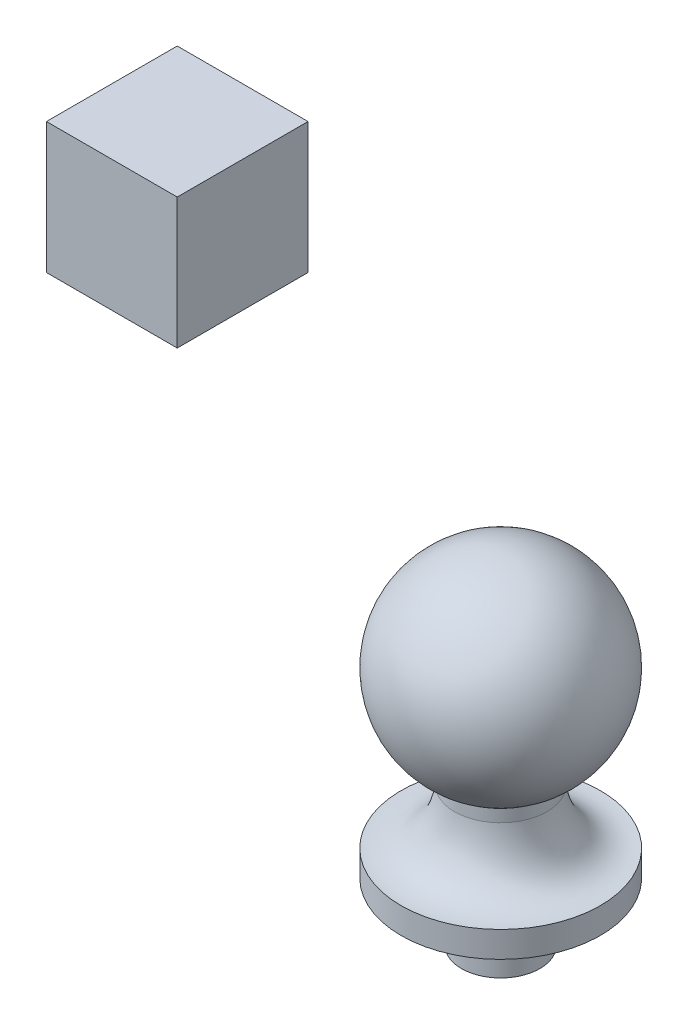
ISO-10303-21;
HEADER;
FILE_DESCRIPTION(('STEP AP214'),'2;1');
FILE_NAME('part.step','',(''),(''),'','','');
FILE_SCHEMA(('AUTOMOTIVE_DESIGN { 1 0 10303 214 1 1 1 1 }'));
ENDSEC;
DATA;
#1=APPLICATION_CONTEXT('core data for automotive mechanical design processes');
#2=APPLICATION_PROTOCOL_DEFINITION('international standard','automotive_design',2000,#1);
#3=PRODUCT_CONTEXT('',#1,'mechanical');
#4=PRODUCT('Part','Part','',(#3));
#5=PRODUCT_RELATED_PRODUCT_CATEGORY('part','',(#4));
#6=PRODUCT_DEFINITION_FORMATION('','',#4);
#7=PRODUCT_DEFINITION_CONTEXT('part definition',#1,'design');
#8=PRODUCT_DEFINITION('design','',#6,#7);
#9=PRODUCT_DEFINITION_SHAPE('','',#8);
#10=(LENGTH_UNIT() NAMED_UNIT(*) SI_UNIT(.MILLI.,.METRE.));
#11=(NAMED_UNIT(*) PLANE_ANGLE_UNIT() SI_UNIT($,.RADIAN.));
#12=(NAMED_UNIT(*) SI_UNIT($,.STERADIAN.) SOLID_ANGLE_UNIT());
#13=UNCERTAINTY_MEASURE_WITH_UNIT(LENGTH_MEASURE(1.E-05),#10,'distance_accuracy_value','');
#14=(GEOMETRIC_REPRESENTATION_CONTEXT(3) GLOBAL_UNCERTAINTY_ASSIGNED_CONTEXT((#13)) GLOBAL_UNIT_ASSIGNED_CONTEXT((#10,
#11,#12)) REPRESENTATION_CONTEXT('',''));
#15=CARTESIAN_POINT('',(0.,0.,0.));
#16=DIRECTION('',(0.,0.,1.));
#17=DIRECTION('',(1.,0.,0.));
#18=AXIS2_PLACEMENT_3D('',#15,#16,#17);
#19=CARTESIAN_POINT('',(-29.7310848230877,15.3257632194869,5.));
#20=DIRECTION('',(1.,0.,0.));
#21=DIRECTION('',(0.,1.,0.));
#22=AXIS2_PLACEMENT_3D('',#19,#20,#21);
#23=PLANE('',#22);
#24=DIRECTION('',(0.,-1.,0.));
#25=VECTOR('',#24,1.);
#26=CARTESIAN_POINT('',(-29.7310848230877,15.3257632194869,-5.));
#27=LINE('',#26,#25);
#28=CARTESIAN_POINT('',(-29.7310848230877,15.3257632194869,-5.));
#29=VERTEX_POINT('',#28);
#30=CARTESIAN_POINT('',(-29.7310848230877,5.32576321948687,-5.));
#31=VERTEX_POINT('',#30);
#32=EDGE_CURVE('E108',#29,#31,#27,.T.);
#33=ORIENTED_EDGE('',*,*,#32,.T.);
#34=DIRECTION('',(0.,0.,-1.));
#35=VECTOR('',#34,1.);
#36=CARTESIAN_POINT('',(-29.7310848230877,5.32576321948687,5.));
#37=LINE('',#36,#35);
#38=CARTESIAN_POINT('',(-29.7310848230877,5.32576321948687,5.));
#39=VERTEX_POINT('',#38);
#40=EDGE_CURVE('E12',#39,#31,#37,.T.);
#41=ORIENTED_EDGE('',*,*,#40,.F.);
#42=DIRECTION('',(0.,-1.,0.));
#43=VECTOR('',#42,1.);
#44=CARTESIAN_POINT('',(-29.7310848230877,15.3257632194869,5.));
#45=LINE('',#44,#43);
#46=CARTESIAN_POINT('',(-29.7310848230877,15.3257632194869,5.));
#47=VERTEX_POINT('',#46);
#48=EDGE_CURVE('E96',#47,#39,#45,.T.);
#49=ORIENTED_EDGE('',*,*,#48,.F.);
#50=DIRECTION('',(0.,0.,-1.));
#51=VECTOR('',#50,1.);
#52=CARTESIAN_POINT('',(-29.7310848230877,15.3257632194869,5.));
#53=LINE('',#52,#51);
#54=EDGE_CURVE('E104',#47,#29,#53,.T.);
#55=ORIENTED_EDGE('',*,*,#54,.T.);
#56=EDGE_LOOP('',(#33,#41,#49,#55));
#57=FACE_BOUND('',#56,.T.);
#58=ADVANCED_FACE('F45',(#57),#23,.F.);
#59=CARTESIAN_POINT('',(-29.7310848230877,5.32576321948687,5.));
#60=DIRECTION('',(0.,1.,0.));
#61=DIRECTION('',(0.,0.,1.));
#62=AXIS2_PLACEMENT_3D('',#59,#60,#61);
#63=PLANE('',#62);
#64=DIRECTION('',(1.,0.,0.));
#65=VECTOR('',#64,1.);
#66=CARTESIAN_POINT('',(-29.7310848230877,5.32576321948687,-5.));
#67=LINE('',#66,#65);
#68=CARTESIAN_POINT('',(-19.7310848230877,5.32576321948687,-5.));
#69=VERTEX_POINT('',#68);
#70=EDGE_CURVE('E100',#31,#69,#67,.T.);
#71=ORIENTED_EDGE('',*,*,#70,.T.);
#72=DIRECTION('',(0.,0.,-1.));
#73=VECTOR('',#72,1.);
#74=CARTESIAN_POINT('',(-19.7310848230877,5.32576321948687,5.));
#75=LINE('',#74,#73);
#76=CARTESIAN_POINT('',(-19.7310848230877,5.32576321948687,5.));
#77=VERTEX_POINT('',#76);
#78=EDGE_CURVE('E53',#77,#69,#75,.T.);
#79=ORIENTED_EDGE('',*,*,#78,.F.);
#80=DIRECTION('',(1.,0.,0.));
#81=VECTOR('',#80,1.);
#82=CARTESIAN_POINT('',(-29.7310848230877,5.32576321948687,5.));
#83=LINE('',#82,#81);
#84=EDGE_CURVE('E91',#39,#77,#83,.T.);
#85=ORIENTED_EDGE('',*,*,#84,.F.);
#86=ORIENTED_EDGE('',*,*,#40,.T.);
#87=EDGE_LOOP('',(#71,#79,#85,#86));
#88=FACE_BOUND('',#87,.T.);
#89=ADVANCED_FACE('F99',(#88),#63,.F.);
#90=CARTESIAN_POINT('',(-19.7310848230877,15.3257632194869,5.));
#91=DIRECTION('',(-1.,0.,0.));
#92=DIRECTION('',(0.,-1.,0.));
#93=AXIS2_PLACEMENT_3D('',#90,#91,#92);
#94=PLANE('',#93);
#95=DIRECTION('',(0.,1.,0.));
#96=VECTOR('',#95,1.);
#97=CARTESIAN_POINT('',(-19.7310848230877,15.3257632194869,-5.));
#98=LINE('',#97,#96);
#99=CARTESIAN_POINT('',(-19.7310848230877,15.3257632194869,-5.));
#100=VERTEX_POINT('',#99);
#101=EDGE_CURVE('E78',#69,#100,#98,.T.);
#102=ORIENTED_EDGE('',*,*,#101,.T.);
#103=DIRECTION('',(0.,0.,-1.));
#104=VECTOR('',#103,1.);
#105=CARTESIAN_POINT('',(-19.7310848230877,15.3257632194869,5.));
#106=LINE('',#105,#104);
#107=CARTESIAN_POINT('',(-19.7310848230877,15.3257632194869,5.));
#108=VERTEX_POINT('',#107);
#109=EDGE_CURVE('E101',#108,#100,#106,.T.);
#110=ORIENTED_EDGE('',*,*,#109,.F.);
#111=DIRECTION('',(0.,1.,0.));
#112=VECTOR('',#111,1.);
#113=CARTESIAN_POINT('',(-19.7310848230877,15.3257632194869,5.));
#114=LINE('',#113,#112);
#115=EDGE_CURVE('E94',#77,#108,#114,.T.);
#116=ORIENTED_EDGE('',*,*,#115,.F.);
#117=ORIENTED_EDGE('',*,*,#78,.T.);
#118=EDGE_LOOP('',(#102,#110,#116,#117));
#119=FACE_BOUND('',#118,.T.);
#120=ADVANCED_FACE('F102',(#119),#94,.F.);
#121=CARTESIAN_POINT('',(-29.7310848230877,15.3257632194869,5.));
#122=DIRECTION('',(0.,-1.,0.));
#123=DIRECTION('',(0.,0.,-1.));
#124=AXIS2_PLACEMENT_3D('',#121,#122,#123);
#125=PLANE('',#124);
#126=DIRECTION('',(-1.,0.,0.));
#127=VECTOR('',#126,1.);
#128=CARTESIAN_POINT('',(-29.7310848230877,15.3257632194869,-5.));
#129=LINE('',#128,#127);
#130=EDGE_CURVE('E84',#100,#29,#129,.T.);
#131=ORIENTED_EDGE('',*,*,#130,.T.);
#132=ORIENTED_EDGE('',*,*,#54,.F.);
#133=DIRECTION('',(-1.,0.,0.));
#134=VECTOR('',#133,1.);
#135=CARTESIAN_POINT('',(-29.7310848230877,15.3257632194869,5.));
#136=LINE('',#135,#134);
#137=EDGE_CURVE('E61',#108,#47,#136,.T.);
#138=ORIENTED_EDGE('',*,*,#137,.F.);
#139=ORIENTED_EDGE('',*,*,#109,.T.);
#140=EDGE_LOOP('',(#131,#132,#138,#139));
#141=FACE_BOUND('',#140,.T.);
#142=ADVANCED_FACE('F115',(#141),#125,.F.);
#143=CARTESIAN_POINT('',(0.,0.,5.));
#144=DIRECTION('',(0.,0.,1.));
#145=DIRECTION('',(1.,0.,0.));
#146=AXIS2_PLACEMENT_3D('',#143,#144,#145);
#147=PLANE('',#146);
#148=ORIENTED_EDGE('',*,*,#48,.T.);
#149=ORIENTED_EDGE('',*,*,#84,.T.);
#150=ORIENTED_EDGE('',*,*,#115,.T.);
#151=ORIENTED_EDGE('',*,*,#137,.T.);
#152=EDGE_LOOP('',(#148,#149,#150,#151));
#153=FACE_BOUND('',#152,.T.);
#154=ADVANCED_FACE('F92',(#153),#147,.T.);
#155=CARTESIAN_POINT('',(0.,0.,-5.));
#156=DIRECTION('',(0.,0.,1.));
#157=DIRECTION('',(1.,0.,0.));
#158=AXIS2_PLACEMENT_3D('',#155,#156,#157);
#159=PLANE('',#158);
#160=ORIENTED_EDGE('',*,*,#32,.F.);
#161=ORIENTED_EDGE('',*,*,#130,.F.);
#162=ORIENTED_EDGE('',*,*,#101,.F.);
#163=ORIENTED_EDGE('',*,*,#70,.F.);
#164=EDGE_LOOP('',(#160,#161,#162,#163));
#165=FACE_BOUND('',#164,.T.);
#166=ADVANCED_FACE('F118',(#165),#159,.F.);
#167=CLOSED_SHELL('',(#58,#89,#120,#142,#154,#166));
#168=MANIFOLD_SOLID_BREP('B2',#167);
#169=CARTESIAN_POINT('',(3.48045796961317E-06,-8.46408040684206,0.));
#170=DIRECTION('',(0.,1.,0.));
#171=DIRECTION('',(0.,0.,-1.));
#172=AXIS2_PLACEMENT_3D('',#169,#170,#171);
#173=SPHERICAL_SURFACE('',#172,7.62);
#174=CARTESIAN_POINT('',(3.48045796961317E-06,-15.2190873720926,0.));
#175=DIRECTION('',(0.,1.,0.));
#176=DIRECTION('',(0.,0.,1.));
#177=AXIS2_PLACEMENT_3D('',#174,#175,#176);
#178=CIRCLE('',#177,3.52622757340146);
#179=CARTESIAN_POINT('',(3.48045796961317E-06,-15.2190873720926,3.52622757340146));
#180=VERTEX_POINT('',#179);
#181=EDGE_CURVE('E44',#180,#180,#178,.T.);
#182=ORIENTED_EDGE('',*,*,#181,.T.);
#183=EDGE_LOOP('',(#182));
#184=FACE_BOUND('',#183,.T.);
#185=ADVANCED_FACE('F168',(#184),#173,.T.);
#186=CARTESIAN_POINT('',(3.48045796961317E-06,3.22270868155958,0.));
#187=DIRECTION('',(0.,1.,0.));
#188=DIRECTION('',(0.,0.,1.));
#189=AXIS2_PLACEMENT_3D('',#186,#187,#188);
#190=CYLINDRICAL_SURFACE('',#189,3.52622757340146);
#191=CARTESIAN_POINT('',(3.48045796961317E-06,-16.2502692387484,0.));
#192=DIRECTION('',(0.,1.,0.));
#193=DIRECTION('',(0.,0.,1.));
#194=AXIS2_PLACEMENT_3D('',#191,#192,#193);
#195=CIRCLE('',#194,3.52622757340146);
#196=CARTESIAN_POINT('',(3.48045796961317E-06,-16.2502692387484,3.52622757340146));
#197=VERTEX_POINT('',#196);
#198=EDGE_CURVE('E174',#197,#197,#195,.T.);
#199=ORIENTED_EDGE('',*,*,#198,.T.);
#200=EDGE_LOOP('',(#199));
#201=FACE_BOUND('',#200,.T.);
#202=ORIENTED_EDGE('',*,*,#181,.F.);
#203=EDGE_LOOP('',(#202));
#204=FACE_BOUND('',#203,.T.);
#205=ADVANCED_FACE('F204',(#201,#204),#190,.T.);
#206=CARTESIAN_POINT('',(3.48045796961317E-06,-16.2502692387484,3.52622757340146));
#207=CARTESIAN_POINT('',(3.48045796961317E-06,-20.6632178474511,4.08753731154932));
#208=CARTESIAN_POINT('',(3.48045796961317E-06,-20.4179848708813,7.62));
#209=B_SPLINE_CURVE_WITH_KNOTS('',2,(#206,#207,#208),.UNSPECIFIED.,.F.,.F.,(3,3),(0.,1.),.UNSPECIFIED.);
#210=CARTESIAN_POINT('',(3.48045796961317E-06,3.22270868155958,0.));
#211=DIRECTION('',(0.,1.,0.));
#212=AXIS1_PLACEMENT('',#210,#211);
#213=SURFACE_OF_REVOLUTION('',#209,#212);
#214=CARTESIAN_POINT('',(3.48045796961317E-06,-20.4179848708813,0.));
#215=DIRECTION('',(0.,1.,0.));
#216=DIRECTION('',(0.,0.,1.));
#217=AXIS2_PLACEMENT_3D('',#214,#215,#216);
#218=CIRCLE('',#217,7.62);
#219=CARTESIAN_POINT('',(3.48045796961317E-06,-20.4179848708813,7.62));
#220=VERTEX_POINT('',#219);
#221=EDGE_CURVE('E178',#220,#220,#218,.T.);
#222=ORIENTED_EDGE('',*,*,#221,.T.);
#223=EDGE_LOOP('',(#222));
#224=FACE_BOUND('',#223,.T.);
#225=ORIENTED_EDGE('',*,*,#198,.F.);
#226=EDGE_LOOP('',(#225));
#227=FACE_BOUND('',#226,.T.);
#228=ADVANCED_FACE('F200',(#224,#227),#213,.F.);
#229=CARTESIAN_POINT('',(3.48045796961317E-06,3.22270868155958,0.));
#230=DIRECTION('',(0.,1.,0.));
#231=DIRECTION('',(0.,0.,1.));
#232=AXIS2_PLACEMENT_3D('',#229,#230,#231);
#233=CYLINDRICAL_SURFACE('',#232,7.62);
#234=CARTESIAN_POINT('',(3.48045796961317E-06,-22.4000244475704,0.));
#235=DIRECTION('',(0.,1.,0.));
#236=DIRECTION('',(0.,0.,1.));
#237=AXIS2_PLACEMENT_3D('',#234,#235,#236);
#238=CIRCLE('',#237,7.62);
#239=CARTESIAN_POINT('',(3.48045796961317E-06,-22.4000244475704,7.62));
#240=VERTEX_POINT('',#239);
#241=EDGE_CURVE('E182',#240,#240,#238,.T.);
#242=ORIENTED_EDGE('',*,*,#241,.T.);
#243=EDGE_LOOP('',(#242));
#244=FACE_BOUND('',#243,.T.);
#245=ORIENTED_EDGE('',*,*,#221,.F.);
#246=EDGE_LOOP('',(#245));
#247=FACE_BOUND('',#246,.T.);
#248=ADVANCED_FACE('F203',(#244,#247),#233,.T.);
#249=CARTESIAN_POINT('',(3.48045796961317E-06,-22.4000244475704,0.));
#250=DIRECTION('',(0.,-1.,0.));
#251=DIRECTION('',(0.,0.,-1.));
#252=AXIS2_PLACEMENT_3D('',#249,#250,#251);
#253=PLANE('',#252);
#254=CARTESIAN_POINT('',(3.48045796961317E-06,-22.4000244475704,0.));
#255=DIRECTION('',(0.,1.,0.));
#256=DIRECTION('',(0.,0.,1.));
#257=AXIS2_PLACEMENT_3D('',#254,#255,#256);
#258=CIRCLE('',#257,3.);
#259=CARTESIAN_POINT('',(3.48045796961317E-06,-22.4000244475704,3.));
#260=VERTEX_POINT('',#259);
#261=EDGE_CURVE('E187',#260,#260,#258,.T.);
#262=ORIENTED_EDGE('',*,*,#261,.T.);
#263=EDGE_LOOP('',(#262));
#264=FACE_BOUND('',#263,.T.);
#265=ORIENTED_EDGE('',*,*,#241,.F.);
#266=EDGE_LOOP('',(#265));
#267=FACE_BOUND('',#266,.T.);
#268=ADVANCED_FACE('F233',(#264,#267),#253,.T.);
#269=CARTESIAN_POINT('',(3.48045796961317E-06,3.22270868155958,0.));
#270=DIRECTION('',(0.,1.,0.));
#271=DIRECTION('',(0.,0.,1.));
#272=AXIS2_PLACEMENT_3D('',#269,#270,#271);
#273=CYLINDRICAL_SURFACE('',#272,3.);
#274=CARTESIAN_POINT('',(3.48045796961317E-06,-26.9000244475704,0.));
#275=DIRECTION('',(0.,1.,0.));
#276=DIRECTION('',(0.,0.,1.));
#277=AXIS2_PLACEMENT_3D('',#274,#275,#276);
#278=CIRCLE('',#277,3.);
#279=CARTESIAN_POINT('',(3.48045796961317E-06,-26.9000244475704,3.));
#280=VERTEX_POINT('',#279);
#281=EDGE_CURVE('E190',#280,#280,#278,.T.);
#282=ORIENTED_EDGE('',*,*,#281,.T.);
#283=EDGE_LOOP('',(#282));
#284=FACE_BOUND('',#283,.T.);
#285=ORIENTED_EDGE('',*,*,#261,.F.);
#286=EDGE_LOOP('',(#285));
#287=FACE_BOUND('',#286,.T.);
#288=ADVANCED_FACE('F242',(#284,#287),#273,.T.);
#289=CARTESIAN_POINT('',(3.48045796961317E-06,-26.9000244475704,0.));
#290=DIRECTION('',(0.,-1.,0.));
#291=DIRECTION('',(0.,0.,-1.));
#292=AXIS2_PLACEMENT_3D('',#289,#290,#291);
#293=PLANE('',#292);
#294=ORIENTED_EDGE('',*,*,#281,.F.);
#295=EDGE_LOOP('',(#294));
#296=FACE_BOUND('',#295,.T.);
#297=ADVANCED_FACE('F251',(#296),#293,.T.);
#298=CLOSED_SHELL('',(#185,#205,#228,#248,#268,#288,#297));
#299=MANIFOLD_SOLID_BREP('B6',#298);
#300=ADVANCED_BREP_SHAPE_REPRESENTATION('',(#18,#168,#299),#14);
#301=SHAPE_DEFINITION_REPRESENTATION(#9,#300);
ENDSEC;
END-ISO-10303-21;
